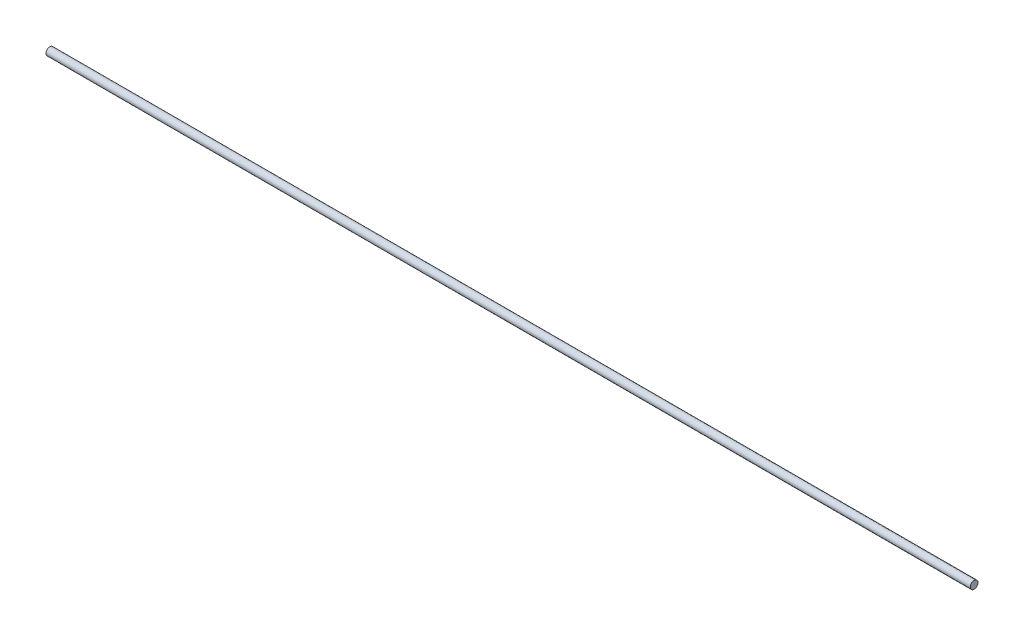
ISO-10303-21;
HEADER;
FILE_DESCRIPTION(('STEP AP214'),'2;1');
FILE_NAME('part.step','',(''),(''),'','','');
FILE_SCHEMA(('AUTOMOTIVE_DESIGN { 1 0 10303 214 1 1 1 1 }'));
ENDSEC;
DATA;
#1=APPLICATION_CONTEXT('core data for automotive mechanical design processes');
#2=APPLICATION_PROTOCOL_DEFINITION('international standard','automotive_design',2000,#1);
#3=PRODUCT_CONTEXT('',#1,'mechanical');
#4=PRODUCT('Part','Part','',(#3));
#5=PRODUCT_RELATED_PRODUCT_CATEGORY('part','',(#4));
#6=PRODUCT_DEFINITION_FORMATION('','',#4);
#7=PRODUCT_DEFINITION_CONTEXT('part definition',#1,'design');
#8=PRODUCT_DEFINITION('design','',#6,#7);
#9=PRODUCT_DEFINITION_SHAPE('','',#8);
#10=(LENGTH_UNIT() NAMED_UNIT(*) SI_UNIT(.MILLI.,.METRE.));
#11=(NAMED_UNIT(*) PLANE_ANGLE_UNIT() SI_UNIT($,.RADIAN.));
#12=(NAMED_UNIT(*) SI_UNIT($,.STERADIAN.) SOLID_ANGLE_UNIT());
#13=UNCERTAINTY_MEASURE_WITH_UNIT(LENGTH_MEASURE(1.E-05),#10,'distance_accuracy_value','');
#14=(GEOMETRIC_REPRESENTATION_CONTEXT(3) GLOBAL_UNCERTAINTY_ASSIGNED_CONTEXT((#13)) GLOBAL_UNIT_ASSIGNED_CONTEXT((#10,
#11,#12)) REPRESENTATION_CONTEXT('',''));
#15=CARTESIAN_POINT('',(0.,0.,0.));
#16=DIRECTION('',(0.,0.,1.));
#17=DIRECTION('',(1.,0.,0.));
#18=AXIS2_PLACEMENT_3D('',#15,#16,#17);
#19=CARTESIAN_POINT('',(1524.,0.,0.));
#20=DIRECTION('',(-1.,0.,0.));
#21=DIRECTION('',(0.,0.,1.));
#22=AXIS2_PLACEMENT_3D('',#19,#20,#21);
#23=CYLINDRICAL_SURFACE('',#22,6.35);
#24=CARTESIAN_POINT('',(1524.,0.,0.));
#25=DIRECTION('',(1.,0.,0.));
#26=DIRECTION('',(0.,0.,-1.));
#27=AXIS2_PLACEMENT_3D('',#24,#25,#26);
#28=CIRCLE('',#27,6.35);
#29=CARTESIAN_POINT('',(1524.,0.,-6.35));
#30=VERTEX_POINT('',#29);
#31=EDGE_CURVE('E10',#30,#30,#28,.T.);
#32=ORIENTED_EDGE('',*,*,#31,.F.);
#33=EDGE_LOOP('',(#32));
#34=FACE_BOUND('',#33,.T.);
#35=CARTESIAN_POINT('',(0.,0.,0.));
#36=DIRECTION('',(1.,0.,0.));
#37=DIRECTION('',(0.,0.,-1.));
#38=AXIS2_PLACEMENT_3D('',#35,#36,#37);
#39=CIRCLE('',#38,6.35);
#40=CARTESIAN_POINT('',(0.,0.,-6.35));
#41=VERTEX_POINT('',#40);
#42=EDGE_CURVE('E35',#41,#41,#39,.T.);
#43=ORIENTED_EDGE('',*,*,#42,.T.);
#44=EDGE_LOOP('',(#43));
#45=FACE_BOUND('',#44,.T.);
#46=ADVANCED_FACE('F32',(#34,#45),#23,.T.);
#47=CARTESIAN_POINT('',(1524.,0.,0.));
#48=DIRECTION('',(1.,0.,0.));
#49=DIRECTION('',(0.,0.,-1.));
#50=AXIS2_PLACEMENT_3D('',#47,#48,#49);
#51=PLANE('',#50);
#52=ORIENTED_EDGE('',*,*,#31,.T.);
#53=EDGE_LOOP('',(#52));
#54=FACE_BOUND('',#53,.T.);
#55=ADVANCED_FACE('F47',(#54),#51,.T.);
#56=CARTESIAN_POINT('',(0.,0.,0.));
#57=DIRECTION('',(1.,0.,0.));
#58=DIRECTION('',(0.,0.,-1.));
#59=AXIS2_PLACEMENT_3D('',#56,#57,#58);
#60=PLANE('',#59);
#61=ORIENTED_EDGE('',*,*,#42,.F.);
#62=EDGE_LOOP('',(#61));
#63=FACE_BOUND('',#62,.T.);
#64=ADVANCED_FACE('F45',(#63),#60,.F.);
#65=CLOSED_SHELL('',(#46,#55,#64));
#66=MANIFOLD_SOLID_BREP('B2',#65);
#67=ADVANCED_BREP_SHAPE_REPRESENTATION('',(#18,#66),#14);
#68=SHAPE_DEFINITION_REPRESENTATION(#9,#67);
ENDSEC;
END-ISO-10303-21;
